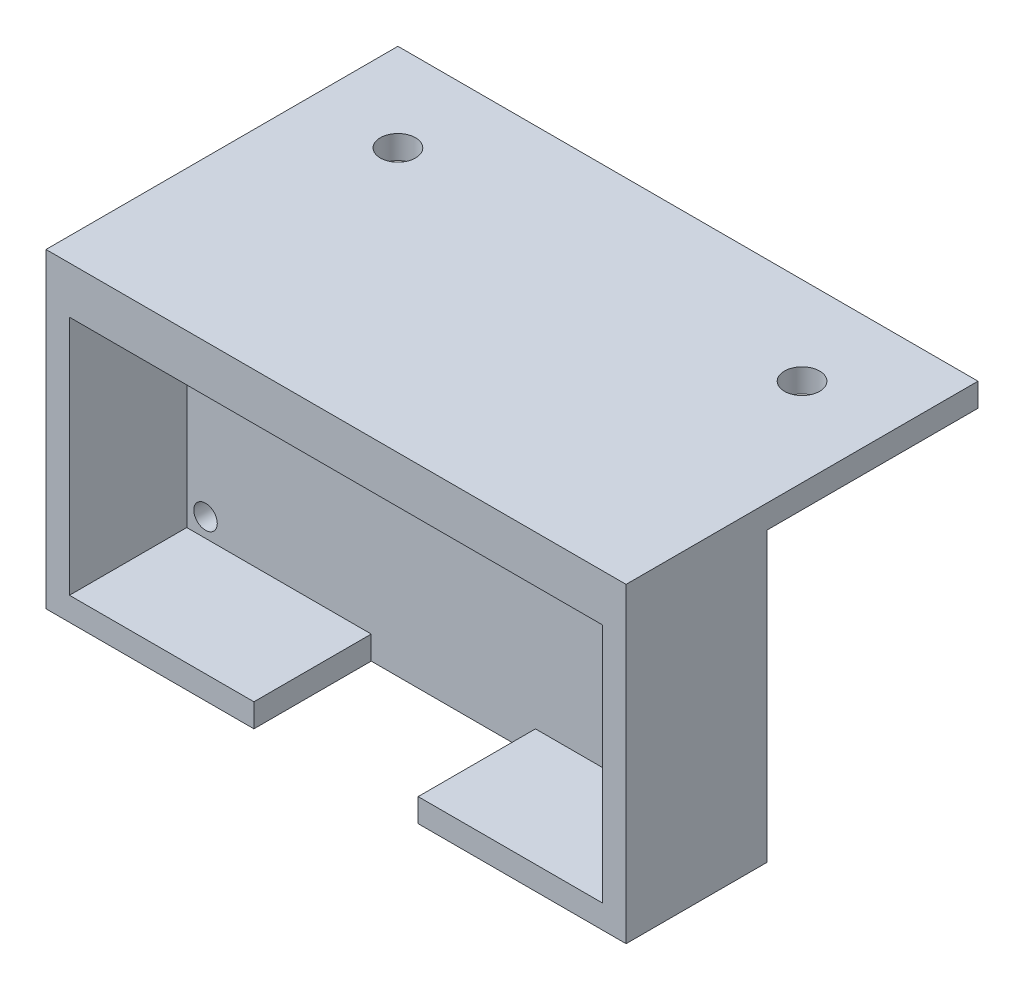
ISO-10303-21;
HEADER;
FILE_DESCRIPTION(('STEP AP214'),'2;1');
FILE_NAME('part.step','',(''),(''),'','','');
FILE_SCHEMA(('AUTOMOTIVE_DESIGN { 1 0 10303 214 1 1 1 1 }'));
ENDSEC;
DATA;
#1=APPLICATION_CONTEXT('core data for automotive mechanical design processes');
#2=APPLICATION_PROTOCOL_DEFINITION('international standard','automotive_design',2000,#1);
#3=PRODUCT_CONTEXT('',#1,'mechanical');
#4=PRODUCT('Part','Part','',(#3));
#5=PRODUCT_RELATED_PRODUCT_CATEGORY('part','',(#4));
#6=PRODUCT_DEFINITION_FORMATION('','',#4);
#7=PRODUCT_DEFINITION_CONTEXT('part definition',#1,'design');
#8=PRODUCT_DEFINITION('design','',#6,#7);
#9=PRODUCT_DEFINITION_SHAPE('','',#8);
#10=(LENGTH_UNIT() NAMED_UNIT(*) SI_UNIT(.MILLI.,.METRE.));
#11=(NAMED_UNIT(*) PLANE_ANGLE_UNIT() SI_UNIT($,.RADIAN.));
#12=(NAMED_UNIT(*) SI_UNIT($,.STERADIAN.) SOLID_ANGLE_UNIT());
#13=UNCERTAINTY_MEASURE_WITH_UNIT(LENGTH_MEASURE(1.E-05),#10,'distance_accuracy_value','');
#14=(GEOMETRIC_REPRESENTATION_CONTEXT(3) GLOBAL_UNCERTAINTY_ASSIGNED_CONTEXT((#13)) GLOBAL_UNIT_ASSIGNED_CONTEXT((#10,
#11,#12)) REPRESENTATION_CONTEXT('',''));
#15=CARTESIAN_POINT('',(0.,0.,0.));
#16=DIRECTION('',(0.,0.,1.));
#17=DIRECTION('',(1.,0.,0.));
#18=AXIS2_PLACEMENT_3D('',#15,#16,#17);
#19=CARTESIAN_POINT('',(-22.9841809315405,9.52821041214751,10.));
#20=DIRECTION('',(1.,0.,0.));
#21=DIRECTION('',(0.,1.,0.));
#22=AXIS2_PLACEMENT_3D('',#19,#20,#21);
#23=PLANE('',#22);
#24=DIRECTION('',(0.,-1.,0.));
#25=VECTOR('',#24,1.);
#26=CARTESIAN_POINT('',(-22.9841809315405,9.52821041214751,10.));
#27=LINE('',#26,#25);
#28=CARTESIAN_POINT('',(-22.9841809315405,11.5282104121475,10.));
#29=VERTEX_POINT('',#28);
#30=CARTESIAN_POINT('',(-22.9841809315405,-15.0017895878525,10.));
#31=VERTEX_POINT('',#30);
#32=EDGE_CURVE('E128',#29,#31,#27,.T.);
#33=ORIENTED_EDGE('',*,*,#32,.F.);
#34=DIRECTION('',(0.,0.,1.));
#35=VECTOR('',#34,1.);
#36=CARTESIAN_POINT('',(-22.9841809315405,11.5282104121475,10.));
#37=LINE('',#36,#35);
#38=CARTESIAN_POINT('',(-22.9841809315405,11.5282104121475,-20.));
#39=VERTEX_POINT('',#38);
#40=EDGE_CURVE('E132',#39,#29,#37,.T.);
#41=ORIENTED_EDGE('',*,*,#40,.F.);
#42=DIRECTION('',(0.,-1.,0.));
#43=VECTOR('',#42,1.);
#44=CARTESIAN_POINT('',(-22.9841809315405,11.5282104121475,-20.));
#45=LINE('',#44,#43);
#46=CARTESIAN_POINT('',(-22.9841809315405,9.52821041214751,-20.));
#47=VERTEX_POINT('',#46);
#48=EDGE_CURVE('E160',#39,#47,#45,.T.);
#49=ORIENTED_EDGE('',*,*,#48,.T.);
#50=DIRECTION('',(0.,0.,1.));
#51=VECTOR('',#50,1.);
#52=CARTESIAN_POINT('',(-22.9841809315405,9.52821041214751,10.));
#53=LINE('',#52,#51);
#54=CARTESIAN_POINT('',(-22.9841809315405,9.52821041214751,-2.));
#55=VERTEX_POINT('',#54);
#56=EDGE_CURVE('E161',#47,#55,#53,.T.);
#57=ORIENTED_EDGE('',*,*,#56,.T.);
#58=DIRECTION('',(0.,1.,0.));
#59=VECTOR('',#58,1.);
#60=CARTESIAN_POINT('',(-22.9841809315405,9.52821041214751,-2.));
#61=LINE('',#60,#59);
#62=CARTESIAN_POINT('',(-22.9841809315405,-15.0017895878525,-2.));
#63=VERTEX_POINT('',#62);
#64=EDGE_CURVE('E195',#63,#55,#61,.T.);
#65=ORIENTED_EDGE('',*,*,#64,.F.);
#66=DIRECTION('',(0.,0.,-1.));
#67=VECTOR('',#66,1.);
#68=CARTESIAN_POINT('',(-22.9841809315405,-15.0017895878525,10.));
#69=LINE('',#68,#67);
#70=EDGE_CURVE('E11',#31,#63,#69,.T.);
#71=ORIENTED_EDGE('',*,*,#70,.F.);
#72=EDGE_LOOP('',(#33,#41,#49,#57,#65,#71));
#73=FACE_BOUND('',#72,.T.);
#74=ADVANCED_FACE('F33',(#73),#23,.F.);
#75=CARTESIAN_POINT('',(-5.25918093154049,-13.0017895878525,10.));
#76=DIRECTION('',(-1.,0.,0.));
#77=DIRECTION('',(0.,-1.,0.));
#78=AXIS2_PLACEMENT_3D('',#75,#76,#77);
#79=PLANE('',#78);
#80=DIRECTION('',(0.,1.,0.));
#81=VECTOR('',#80,1.);
#82=CARTESIAN_POINT('',(-5.25918093154049,-13.0017895878525,0.));
#83=LINE('',#82,#81);
#84=CARTESIAN_POINT('',(-5.25918093154049,-15.0017895878525,0.));
#85=VERTEX_POINT('',#84);
#86=CARTESIAN_POINT('',(-5.25918093154049,-13.0017895878525,0.));
#87=VERTEX_POINT('',#86);
#88=EDGE_CURVE('E207',#85,#87,#83,.T.);
#89=ORIENTED_EDGE('',*,*,#88,.T.);
#90=DIRECTION('',(0.,0.,-1.));
#91=VECTOR('',#90,1.);
#92=CARTESIAN_POINT('',(-5.25918093154049,-13.0017895878525,10.));
#93=LINE('',#92,#91);
#94=CARTESIAN_POINT('',(-5.25918093154049,-13.0017895878525,10.));
#95=VERTEX_POINT('',#94);
#96=EDGE_CURVE('E266',#95,#87,#93,.T.);
#97=ORIENTED_EDGE('',*,*,#96,.F.);
#98=DIRECTION('',(0.,1.,0.));
#99=VECTOR('',#98,1.);
#100=CARTESIAN_POINT('',(-5.25918093154049,-13.0017895878525,10.));
#101=LINE('',#100,#99);
#102=CARTESIAN_POINT('',(-5.25918093154049,-15.0017895878525,10.));
#103=VERTEX_POINT('',#102);
#104=EDGE_CURVE('E211',#103,#95,#101,.T.);
#105=ORIENTED_EDGE('',*,*,#104,.F.);
#106=DIRECTION('',(0.,0.,-1.));
#107=VECTOR('',#106,1.);
#108=CARTESIAN_POINT('',(-5.25918093154049,-15.0017895878525,10.));
#109=LINE('',#108,#107);
#110=EDGE_CURVE('E41',#103,#85,#109,.T.);
#111=ORIENTED_EDGE('',*,*,#110,.T.);
#112=EDGE_LOOP('',(#89,#97,#105,#111));
#113=FACE_BOUND('',#112,.T.);
#114=ADVANCED_FACE('F272',(#113),#79,.F.);
#115=CARTESIAN_POINT('',(-20.9841809315405,-13.0017895878525,10.));
#116=DIRECTION('',(0.,-1.,0.));
#117=DIRECTION('',(1.,0.,0.));
#118=AXIS2_PLACEMENT_3D('',#115,#116,#117);
#119=PLANE('',#118);
#120=DIRECTION('',(-1.,0.,0.));
#121=VECTOR('',#120,1.);
#122=CARTESIAN_POINT('',(-20.9841809315405,-13.0017895878525,0.));
#123=LINE('',#122,#121);
#124=CARTESIAN_POINT('',(-20.9841809315405,-13.0017895878525,0.));
#125=VERTEX_POINT('',#124);
#126=EDGE_CURVE('E230',#87,#125,#123,.T.);
#127=ORIENTED_EDGE('',*,*,#126,.T.);
#128=DIRECTION('',(0.,0.,-1.));
#129=VECTOR('',#128,1.);
#130=CARTESIAN_POINT('',(-20.9841809315405,-13.0017895878525,10.));
#131=LINE('',#130,#129);
#132=CARTESIAN_POINT('',(-20.9841809315405,-13.0017895878525,10.));
#133=VERTEX_POINT('',#132);
#134=EDGE_CURVE('E263',#133,#125,#131,.T.);
#135=ORIENTED_EDGE('',*,*,#134,.F.);
#136=DIRECTION('',(-1.,0.,0.));
#137=VECTOR('',#136,1.);
#138=CARTESIAN_POINT('',(-20.9841809315405,-13.0017895878525,10.));
#139=LINE('',#138,#137);
#140=EDGE_CURVE('E213',#95,#133,#139,.T.);
#141=ORIENTED_EDGE('',*,*,#140,.F.);
#142=ORIENTED_EDGE('',*,*,#96,.T.);
#143=EDGE_LOOP('',(#127,#135,#141,#142));
#144=FACE_BOUND('',#143,.T.);
#145=ADVANCED_FACE('F302',(#144),#119,.F.);
#146=CARTESIAN_POINT('',(-20.9841809315405,7.52821041214751,10.));
#147=DIRECTION('',(-1.,0.,0.));
#148=DIRECTION('',(0.,-1.,0.));
#149=AXIS2_PLACEMENT_3D('',#146,#147,#148);
#150=PLANE('',#149);
#151=DIRECTION('',(0.,1.,0.));
#152=VECTOR('',#151,1.);
#153=CARTESIAN_POINT('',(-20.9841809315405,7.52821041214751,0.));
#154=LINE('',#153,#152);
#155=CARTESIAN_POINT('',(-20.9841809315405,7.52821041214751,0.));
#156=VERTEX_POINT('',#155);
#157=EDGE_CURVE('E233',#125,#156,#154,.T.);
#158=ORIENTED_EDGE('',*,*,#157,.T.);
#159=DIRECTION('',(0.,0.,-1.));
#160=VECTOR('',#159,1.);
#161=CARTESIAN_POINT('',(-20.9841809315405,7.52821041214751,10.));
#162=LINE('',#161,#160);
#163=CARTESIAN_POINT('',(-20.9841809315405,7.52821041214751,10.));
#164=VERTEX_POINT('',#163);
#165=EDGE_CURVE('E260',#164,#156,#162,.T.);
#166=ORIENTED_EDGE('',*,*,#165,.F.);
#167=DIRECTION('',(0.,1.,0.));
#168=VECTOR('',#167,1.);
#169=CARTESIAN_POINT('',(-20.9841809315405,7.52821041214751,10.));
#170=LINE('',#169,#168);
#171=EDGE_CURVE('E215',#133,#164,#170,.T.);
#172=ORIENTED_EDGE('',*,*,#171,.F.);
#173=ORIENTED_EDGE('',*,*,#134,.T.);
#174=EDGE_LOOP('',(#158,#166,#172,#173));
#175=FACE_BOUND('',#174,.T.);
#176=ADVANCED_FACE('F297',(#175),#150,.F.);
#177=CARTESIAN_POINT('',(-20.9841809315405,7.52821041214751,10.));
#178=DIRECTION('',(0.,1.,0.));
#179=DIRECTION('',(-1.,0.,0.));
#180=AXIS2_PLACEMENT_3D('',#177,#178,#179);
#181=PLANE('',#180);
#182=DIRECTION('',(1.,0.,0.));
#183=VECTOR('',#182,1.);
#184=CARTESIAN_POINT('',(-20.9841809315405,7.52821041214751,0.));
#185=LINE('',#184,#183);
#186=CARTESIAN_POINT('',(24.4658190684595,7.52821041214751,0.));
#187=VERTEX_POINT('',#186);
#188=EDGE_CURVE('E236',#156,#187,#185,.T.);
#189=ORIENTED_EDGE('',*,*,#188,.T.);
#190=DIRECTION('',(0.,0.,-1.));
#191=VECTOR('',#190,1.);
#192=CARTESIAN_POINT('',(24.4658190684595,7.52821041214751,10.));
#193=LINE('',#192,#191);
#194=CARTESIAN_POINT('',(24.4658190684595,7.52821041214751,10.));
#195=VERTEX_POINT('',#194);
#196=EDGE_CURVE('E257',#195,#187,#193,.T.);
#197=ORIENTED_EDGE('',*,*,#196,.F.);
#198=DIRECTION('',(1.,0.,0.));
#199=VECTOR('',#198,1.);
#200=CARTESIAN_POINT('',(-20.9841809315405,7.52821041214751,10.));
#201=LINE('',#200,#199);
#202=EDGE_CURVE('E217',#164,#195,#201,.T.);
#203=ORIENTED_EDGE('',*,*,#202,.F.);
#204=ORIENTED_EDGE('',*,*,#165,.T.);
#205=EDGE_LOOP('',(#189,#197,#203,#204));
#206=FACE_BOUND('',#205,.T.);
#207=ADVANCED_FACE('F294',(#206),#181,.F.);
#208=CARTESIAN_POINT('',(24.4658190684595,7.52821041214751,10.));
#209=DIRECTION('',(1.,0.,0.));
#210=DIRECTION('',(0.,1.,0.));
#211=AXIS2_PLACEMENT_3D('',#208,#209,#210);
#212=PLANE('',#211);
#213=DIRECTION('',(0.,-1.,0.));
#214=VECTOR('',#213,1.);
#215=CARTESIAN_POINT('',(24.4658190684595,7.52821041214751,0.));
#216=LINE('',#215,#214);
#217=CARTESIAN_POINT('',(24.4658190684595,-13.0017895878525,0.));
#218=VERTEX_POINT('',#217);
#219=EDGE_CURVE('E239',#187,#218,#216,.T.);
#220=ORIENTED_EDGE('',*,*,#219,.T.);
#221=DIRECTION('',(0.,0.,-1.));
#222=VECTOR('',#221,1.);
#223=CARTESIAN_POINT('',(24.4658190684595,-13.0017895878525,10.));
#224=LINE('',#223,#222);
#225=CARTESIAN_POINT('',(24.4658190684595,-13.0017895878525,10.));
#226=VERTEX_POINT('',#225);
#227=EDGE_CURVE('E254',#226,#218,#224,.T.);
#228=ORIENTED_EDGE('',*,*,#227,.F.);
#229=DIRECTION('',(0.,-1.,0.));
#230=VECTOR('',#229,1.);
#231=CARTESIAN_POINT('',(24.4658190684595,7.52821041214751,10.));
#232=LINE('',#231,#230);
#233=EDGE_CURVE('E219',#195,#226,#232,.T.);
#234=ORIENTED_EDGE('',*,*,#233,.F.);
#235=ORIENTED_EDGE('',*,*,#196,.T.);
#236=EDGE_LOOP('',(#220,#228,#234,#235));
#237=FACE_BOUND('',#236,.T.);
#238=ADVANCED_FACE('F289',(#237),#212,.F.);
#239=CARTESIAN_POINT('',(8.74081906845951,-13.0017895878525,10.));
#240=DIRECTION('',(0.,-1.,0.));
#241=DIRECTION('',(0.,0.,-1.));
#242=AXIS2_PLACEMENT_3D('',#239,#240,#241);
#243=PLANE('',#242);
#244=DIRECTION('',(-1.,0.,0.));
#245=VECTOR('',#244,1.);
#246=CARTESIAN_POINT('',(8.74081906845951,-13.0017895878525,0.));
#247=LINE('',#246,#245);
#248=CARTESIAN_POINT('',(8.74081906845951,-13.0017895878525,0.));
#249=VERTEX_POINT('',#248);
#250=EDGE_CURVE('E242',#218,#249,#247,.T.);
#251=ORIENTED_EDGE('',*,*,#250,.T.);
#252=DIRECTION('',(0.,0.,-1.));
#253=VECTOR('',#252,1.);
#254=CARTESIAN_POINT('',(8.74081906845951,-13.0017895878525,10.));
#255=LINE('',#254,#253);
#256=CARTESIAN_POINT('',(8.74081906845951,-13.0017895878525,10.));
#257=VERTEX_POINT('',#256);
#258=EDGE_CURVE('E251',#257,#249,#255,.T.);
#259=ORIENTED_EDGE('',*,*,#258,.F.);
#260=DIRECTION('',(-1.,0.,0.));
#261=VECTOR('',#260,1.);
#262=CARTESIAN_POINT('',(8.74081906845951,-13.0017895878525,10.));
#263=LINE('',#262,#261);
#264=EDGE_CURVE('E221',#226,#257,#263,.T.);
#265=ORIENTED_EDGE('',*,*,#264,.F.);
#266=ORIENTED_EDGE('',*,*,#227,.T.);
#267=EDGE_LOOP('',(#251,#259,#265,#266));
#268=FACE_BOUND('',#267,.T.);
#269=ADVANCED_FACE('F286',(#268),#243,.F.);
#270=CARTESIAN_POINT('',(8.74081906845951,-13.0017895878525,10.));
#271=DIRECTION('',(1.,0.,0.));
#272=DIRECTION('',(0.,1.,0.));
#273=AXIS2_PLACEMENT_3D('',#270,#271,#272);
#274=PLANE('',#273);
#275=DIRECTION('',(0.,-1.,0.));
#276=VECTOR('',#275,1.);
#277=CARTESIAN_POINT('',(8.74081906845951,-13.0017895878525,0.));
#278=LINE('',#277,#276);
#279=CARTESIAN_POINT('',(8.74081906845951,-15.0017895878525,0.));
#280=VERTEX_POINT('',#279);
#281=EDGE_CURVE('E135',#249,#280,#278,.T.);
#282=ORIENTED_EDGE('',*,*,#281,.T.);
#283=DIRECTION('',(0.,0.,-1.));
#284=VECTOR('',#283,1.);
#285=CARTESIAN_POINT('',(8.74081906845951,-15.0017895878525,10.));
#286=LINE('',#285,#284);
#287=CARTESIAN_POINT('',(8.74081906845951,-15.0017895878525,10.));
#288=VERTEX_POINT('',#287);
#289=EDGE_CURVE('E248',#288,#280,#286,.T.);
#290=ORIENTED_EDGE('',*,*,#289,.F.);
#291=DIRECTION('',(0.,-1.,0.));
#292=VECTOR('',#291,1.);
#293=CARTESIAN_POINT('',(8.74081906845951,-13.0017895878525,10.));
#294=LINE('',#293,#292);
#295=EDGE_CURVE('E223',#257,#288,#294,.T.);
#296=ORIENTED_EDGE('',*,*,#295,.F.);
#297=ORIENTED_EDGE('',*,*,#258,.T.);
#298=EDGE_LOOP('',(#282,#290,#296,#297));
#299=FACE_BOUND('',#298,.T.);
#300=ADVANCED_FACE('F281',(#299),#274,.F.);
#301=CARTESIAN_POINT('',(8.74081906845951,-15.0017895878525,10.));
#302=DIRECTION('',(0.,1.,0.));
#303=DIRECTION('',(0.,0.,1.));
#304=AXIS2_PLACEMENT_3D('',#301,#302,#303);
#305=PLANE('',#304);
#306=ORIENTED_EDGE('',*,*,#289,.T.);
#307=DIRECTION('',(-1.,0.,0.));
#308=VECTOR('',#307,1.);
#309=CARTESIAN_POINT('',(-22.9841809315405,-15.0017895878525,0.));
#310=LINE('',#309,#308);
#311=EDGE_CURVE('E192',#280,#85,#310,.T.);
#312=ORIENTED_EDGE('',*,*,#311,.T.);
#313=ORIENTED_EDGE('',*,*,#110,.F.);
#314=DIRECTION('',(1.,0.,0.));
#315=VECTOR('',#314,1.);
#316=CARTESIAN_POINT('',(-22.9841809315405,-15.0017895878525,10.));
#317=LINE('',#316,#315);
#318=EDGE_CURVE('E134',#31,#103,#317,.T.);
#319=ORIENTED_EDGE('',*,*,#318,.F.);
#320=ORIENTED_EDGE('',*,*,#70,.T.);
#321=DIRECTION('',(-1.,0.,0.));
#322=VECTOR('',#321,1.);
#323=CARTESIAN_POINT('',(-22.9841809315405,-15.0017895878525,-2.));
#324=LINE('',#323,#322);
#325=CARTESIAN_POINT('',(26.4658190684595,-15.0017895878525,-2.));
#326=VERTEX_POINT('',#325);
#327=EDGE_CURVE('E204',#326,#63,#324,.T.);
#328=ORIENTED_EDGE('',*,*,#327,.F.);
#329=DIRECTION('',(0.,0.,-1.));
#330=VECTOR('',#329,1.);
#331=CARTESIAN_POINT('',(26.4658190684595,-15.0017895878525,10.));
#332=LINE('',#331,#330);
#333=CARTESIAN_POINT('',(26.4658190684595,-15.0017895878525,10.));
#334=VERTEX_POINT('',#333);
#335=EDGE_CURVE('E227',#334,#326,#332,.T.);
#336=ORIENTED_EDGE('',*,*,#335,.F.);
#337=DIRECTION('',(1.,0.,0.));
#338=VECTOR('',#337,1.);
#339=CARTESIAN_POINT('',(8.74081906845951,-15.0017895878525,10.));
#340=LINE('',#339,#338);
#341=EDGE_CURVE('E48',#288,#334,#340,.T.);
#342=ORIENTED_EDGE('',*,*,#341,.F.);
#343=EDGE_LOOP('',(#306,#312,#313,#319,#320,#328,#336,#342));
#344=FACE_BOUND('',#343,.T.);
#345=ADVANCED_FACE('F275',(#344),#305,.F.);
#346=CARTESIAN_POINT('',(26.4658190684595,9.52821041214751,10.));
#347=DIRECTION('',(-1.,0.,0.));
#348=DIRECTION('',(0.,0.,1.));
#349=AXIS2_PLACEMENT_3D('',#346,#347,#348);
#350=PLANE('',#349);
#351=ORIENTED_EDGE('',*,*,#335,.T.);
#352=DIRECTION('',(0.,-1.,0.));
#353=VECTOR('',#352,1.);
#354=CARTESIAN_POINT('',(26.4658190684595,9.52821041214751,-2.));
#355=LINE('',#354,#353);
#356=CARTESIAN_POINT('',(26.4658190684595,9.52821041214751,-2.));
#357=VERTEX_POINT('',#356);
#358=EDGE_CURVE('E201',#357,#326,#355,.T.);
#359=ORIENTED_EDGE('',*,*,#358,.F.);
#360=DIRECTION('',(0.,0.,-1.));
#361=VECTOR('',#360,1.);
#362=CARTESIAN_POINT('',(26.4658190684595,9.52821041214751,10.));
#363=LINE('',#362,#361);
#364=CARTESIAN_POINT('',(26.4658190684595,9.52821041214751,-20.));
#365=VERTEX_POINT('',#364);
#366=EDGE_CURVE('E152',#357,#365,#363,.T.);
#367=ORIENTED_EDGE('',*,*,#366,.T.);
#368=DIRECTION('',(0.,-1.,0.));
#369=VECTOR('',#368,1.);
#370=CARTESIAN_POINT('',(26.4658190684595,11.5282104121475,-20.));
#371=LINE('',#370,#369);
#372=CARTESIAN_POINT('',(26.4658190684595,11.5282104121475,-20.));
#373=VERTEX_POINT('',#372);
#374=EDGE_CURVE('E167',#373,#365,#371,.T.);
#375=ORIENTED_EDGE('',*,*,#374,.F.);
#376=DIRECTION('',(0.,0.,-1.));
#377=VECTOR('',#376,1.);
#378=CARTESIAN_POINT('',(26.4658190684595,11.5282104121475,10.));
#379=LINE('',#378,#377);
#380=CARTESIAN_POINT('',(26.4658190684595,11.5282104121475,10.));
#381=VERTEX_POINT('',#380);
#382=EDGE_CURVE('E144',#381,#373,#379,.T.);
#383=ORIENTED_EDGE('',*,*,#382,.F.);
#384=DIRECTION('',(0.,1.,0.));
#385=VECTOR('',#384,1.);
#386=CARTESIAN_POINT('',(26.4658190684595,9.52821041214751,10.));
#387=LINE('',#386,#385);
#388=EDGE_CURVE('E141',#334,#381,#387,.T.);
#389=ORIENTED_EDGE('',*,*,#388,.F.);
#390=EDGE_LOOP('',(#351,#359,#367,#375,#383,#389));
#391=FACE_BOUND('',#390,.T.);
#392=ADVANCED_FACE('F372',(#391),#350,.F.);
#393=CARTESIAN_POINT('',(0.,0.,10.));
#394=DIRECTION('',(0.,0.,1.));
#395=DIRECTION('',(1.,0.,0.));
#396=AXIS2_PLACEMENT_3D('',#393,#394,#395);
#397=PLANE('',#396);
#398=ORIENTED_EDGE('',*,*,#32,.T.);
#399=ORIENTED_EDGE('',*,*,#318,.T.);
#400=ORIENTED_EDGE('',*,*,#104,.T.);
#401=ORIENTED_EDGE('',*,*,#140,.T.);
#402=ORIENTED_EDGE('',*,*,#171,.T.);
#403=ORIENTED_EDGE('',*,*,#202,.T.);
#404=ORIENTED_EDGE('',*,*,#233,.T.);
#405=ORIENTED_EDGE('',*,*,#264,.T.);
#406=ORIENTED_EDGE('',*,*,#295,.T.);
#407=ORIENTED_EDGE('',*,*,#341,.T.);
#408=ORIENTED_EDGE('',*,*,#388,.T.);
#409=DIRECTION('',(1.,0.,0.));
#410=VECTOR('',#409,1.);
#411=CARTESIAN_POINT('',(-22.9841809315405,11.5282104121475,10.));
#412=LINE('',#411,#410);
#413=EDGE_CURVE('E138',#29,#381,#412,.T.);
#414=ORIENTED_EDGE('',*,*,#413,.F.);
#415=EDGE_LOOP('',(#398,#399,#400,#401,#402,#403,#404,#405,#406,#407,#408,#414));
#416=FACE_BOUND('',#415,.T.);
#417=ADVANCED_FACE('F139',(#416),#397,.T.);
#418=CARTESIAN_POINT('',(0.,0.,0.));
#419=DIRECTION('',(0.,0.,1.));
#420=DIRECTION('',(1.,0.,0.));
#421=AXIS2_PLACEMENT_3D('',#418,#419,#420);
#422=PLANE('',#421);
#423=CARTESIAN_POINT('',(22.8658190684595,-11.4017895878525,0.));
#424=DIRECTION('',(0.,0.,1.));
#425=DIRECTION('',(-1.,0.,0.));
#426=AXIS2_PLACEMENT_3D('',#423,#424,#425);
#427=CIRCLE('',#426,1.);
#428=CARTESIAN_POINT('',(21.8658190684595,-11.4017895878525,0.));
#429=VERTEX_POINT('',#428);
#430=EDGE_CURVE('E175',#429,#429,#427,.T.);
#431=ORIENTED_EDGE('',*,*,#430,.F.);
#432=EDGE_LOOP('',(#431));
#433=FACE_BOUND('',#432,.T.);
#434=CARTESIAN_POINT('',(22.8658190684595,5.92821041214751,0.));
#435=DIRECTION('',(0.,0.,1.));
#436=DIRECTION('',(1.,0.,0.));
#437=AXIS2_PLACEMENT_3D('',#434,#435,#436);
#438=CIRCLE('',#437,1.);
#439=CARTESIAN_POINT('',(23.8658190684595,5.92821041214751,0.));
#440=VERTEX_POINT('',#439);
#441=EDGE_CURVE('E181',#440,#440,#438,.T.);
#442=ORIENTED_EDGE('',*,*,#441,.F.);
#443=EDGE_LOOP('',(#442));
#444=FACE_BOUND('',#443,.T.);
#445=CARTESIAN_POINT('',(-19.3841809315405,5.92821041214751,0.));
#446=DIRECTION('',(0.,0.,1.));
#447=DIRECTION('',(-1.,0.,0.));
#448=AXIS2_PLACEMENT_3D('',#445,#446,#447);
#449=CIRCLE('',#448,1.);
#450=CARTESIAN_POINT('',(-20.3841809315405,5.92821041214751,0.));
#451=VERTEX_POINT('',#450);
#452=EDGE_CURVE('E170',#451,#451,#449,.T.);
#453=ORIENTED_EDGE('',*,*,#452,.F.);
#454=EDGE_LOOP('',(#453));
#455=FACE_BOUND('',#454,.T.);
#456=CARTESIAN_POINT('',(-19.3841809315405,-11.4017895878525,0.));
#457=DIRECTION('',(0.,0.,1.));
#458=DIRECTION('',(1.,0.,0.));
#459=AXIS2_PLACEMENT_3D('',#456,#457,#458);
#460=CIRCLE('',#459,1.);
#461=CARTESIAN_POINT('',(-18.3841809315405,-11.4017895878525,0.));
#462=VERTEX_POINT('',#461);
#463=EDGE_CURVE('E174',#462,#462,#460,.T.);
#464=ORIENTED_EDGE('',*,*,#463,.F.);
#465=EDGE_LOOP('',(#464));
#466=FACE_BOUND('',#465,.T.);
#467=ORIENTED_EDGE('',*,*,#281,.F.);
#468=ORIENTED_EDGE('',*,*,#250,.F.);
#469=ORIENTED_EDGE('',*,*,#219,.F.);
#470=ORIENTED_EDGE('',*,*,#188,.F.);
#471=ORIENTED_EDGE('',*,*,#157,.F.);
#472=ORIENTED_EDGE('',*,*,#126,.F.);
#473=ORIENTED_EDGE('',*,*,#88,.F.);
#474=ORIENTED_EDGE('',*,*,#311,.F.);
#475=EDGE_LOOP('',(#467,#468,#469,#470,#471,#472,#473,#474));
#476=FACE_BOUND('',#475,.T.);
#477=ADVANCED_FACE('F278',(#433,#444,#455,#466,#476),#422,.T.);
#478=CARTESIAN_POINT('',(0.,0.,-2.));
#479=DIRECTION('',(0.,0.,1.));
#480=DIRECTION('',(1.,0.,0.));
#481=AXIS2_PLACEMENT_3D('',#478,#479,#480);
#482=PLANE('',#481);
#483=CARTESIAN_POINT('',(22.8658190684595,-11.4017895878525,-2.));
#484=DIRECTION('',(0.,0.,1.));
#485=DIRECTION('',(-1.,0.,0.));
#486=AXIS2_PLACEMENT_3D('',#483,#484,#485);
#487=CIRCLE('',#486,1.);
#488=CARTESIAN_POINT('',(21.8658190684595,-11.4017895878525,-2.));
#489=VERTEX_POINT('',#488);
#490=EDGE_CURVE('E171',#489,#489,#487,.T.);
#491=ORIENTED_EDGE('',*,*,#490,.T.);
#492=EDGE_LOOP('',(#491));
#493=FACE_BOUND('',#492,.T.);
#494=CARTESIAN_POINT('',(22.8658190684595,5.92821041214751,-2.));
#495=DIRECTION('',(0.,0.,1.));
#496=DIRECTION('',(1.,0.,0.));
#497=AXIS2_PLACEMENT_3D('',#494,#495,#496);
#498=CIRCLE('',#497,1.);
#499=CARTESIAN_POINT('',(23.8658190684595,5.92821041214751,-2.));
#500=VERTEX_POINT('',#499);
#501=EDGE_CURVE('E178',#500,#500,#498,.T.);
#502=ORIENTED_EDGE('',*,*,#501,.T.);
#503=EDGE_LOOP('',(#502));
#504=FACE_BOUND('',#503,.T.);
#505=CARTESIAN_POINT('',(-19.3841809315405,5.92821041214751,-2.));
#506=DIRECTION('',(0.,0.,1.));
#507=DIRECTION('',(-1.,0.,0.));
#508=AXIS2_PLACEMENT_3D('',#505,#506,#507);
#509=CIRCLE('',#508,1.);
#510=CARTESIAN_POINT('',(-20.3841809315405,5.92821041214751,-2.));
#511=VERTEX_POINT('',#510);
#512=EDGE_CURVE('E184',#511,#511,#509,.T.);
#513=ORIENTED_EDGE('',*,*,#512,.T.);
#514=EDGE_LOOP('',(#513));
#515=FACE_BOUND('',#514,.T.);
#516=CARTESIAN_POINT('',(-19.3841809315405,-11.4017895878525,-2.));
#517=DIRECTION('',(0.,0.,1.));
#518=DIRECTION('',(1.,0.,0.));
#519=AXIS2_PLACEMENT_3D('',#516,#517,#518);
#520=CIRCLE('',#519,1.);
#521=CARTESIAN_POINT('',(-18.3841809315405,-11.4017895878525,-2.));
#522=VERTEX_POINT('',#521);
#523=EDGE_CURVE('E189',#522,#522,#520,.T.);
#524=ORIENTED_EDGE('',*,*,#523,.T.);
#525=EDGE_LOOP('',(#524));
#526=FACE_BOUND('',#525,.T.);
#527=ORIENTED_EDGE('',*,*,#64,.T.);
#528=DIRECTION('',(1.,0.,0.));
#529=VECTOR('',#528,1.);
#530=CARTESIAN_POINT('',(-22.9841809315405,9.52821041214751,-2.));
#531=LINE('',#530,#529);
#532=EDGE_CURVE('E198',#55,#357,#531,.T.);
#533=ORIENTED_EDGE('',*,*,#532,.T.);
#534=ORIENTED_EDGE('',*,*,#358,.T.);
#535=ORIENTED_EDGE('',*,*,#327,.T.);
#536=EDGE_LOOP('',(#527,#533,#534,#535));
#537=FACE_BOUND('',#536,.T.);
#538=ADVANCED_FACE('F385',(#493,#504,#515,#526,#537),#482,.F.);
#539=CARTESIAN_POINT('',(-19.3841809315405,-11.4017895878525,-2.));
#540=DIRECTION('',(0.,0.,1.));
#541=DIRECTION('',(1.,0.,0.));
#542=AXIS2_PLACEMENT_3D('',#539,#540,#541);
#543=CYLINDRICAL_SURFACE('',#542,1.);
#544=ORIENTED_EDGE('',*,*,#523,.F.);
#545=EDGE_LOOP('',(#544));
#546=FACE_BOUND('',#545,.T.);
#547=ORIENTED_EDGE('',*,*,#463,.T.);
#548=EDGE_LOOP('',(#547));
#549=FACE_BOUND('',#548,.T.);
#550=ADVANCED_FACE('F394',(#546,#549),#543,.F.);
#551=CARTESIAN_POINT('',(-19.3841809315405,5.92821041214751,-2.));
#552=DIRECTION('',(0.,0.,1.));
#553=DIRECTION('',(1.,0.,0.));
#554=AXIS2_PLACEMENT_3D('',#551,#552,#553);
#555=CYLINDRICAL_SURFACE('',#554,1.);
#556=ORIENTED_EDGE('',*,*,#512,.F.);
#557=EDGE_LOOP('',(#556));
#558=FACE_BOUND('',#557,.T.);
#559=ORIENTED_EDGE('',*,*,#452,.T.);
#560=EDGE_LOOP('',(#559));
#561=FACE_BOUND('',#560,.T.);
#562=ADVANCED_FACE('F399',(#558,#561),#555,.F.);
#563=CARTESIAN_POINT('',(22.8658190684595,5.92821041214751,-2.));
#564=DIRECTION('',(0.,0.,1.));
#565=DIRECTION('',(1.,0.,0.));
#566=AXIS2_PLACEMENT_3D('',#563,#564,#565);
#567=CYLINDRICAL_SURFACE('',#566,1.);
#568=ORIENTED_EDGE('',*,*,#501,.F.);
#569=EDGE_LOOP('',(#568));
#570=FACE_BOUND('',#569,.T.);
#571=ORIENTED_EDGE('',*,*,#441,.T.);
#572=EDGE_LOOP('',(#571));
#573=FACE_BOUND('',#572,.T.);
#574=ADVANCED_FACE('F409',(#570,#573),#567,.F.);
#575=CARTESIAN_POINT('',(22.8658190684595,-11.4017895878525,-2.));
#576=DIRECTION('',(0.,0.,1.));
#577=DIRECTION('',(1.,0.,0.));
#578=AXIS2_PLACEMENT_3D('',#575,#576,#577);
#579=CYLINDRICAL_SURFACE('',#578,1.);
#580=ORIENTED_EDGE('',*,*,#490,.F.);
#581=EDGE_LOOP('',(#580));
#582=FACE_BOUND('',#581,.T.);
#583=ORIENTED_EDGE('',*,*,#430,.T.);
#584=EDGE_LOOP('',(#583));
#585=FACE_BOUND('',#584,.T.);
#586=ADVANCED_FACE('F418',(#582,#585),#579,.F.);
#587=CARTESIAN_POINT('',(0.,9.52821041214751,0.));
#588=DIRECTION('',(0.,-1.,0.));
#589=DIRECTION('',(1.,0.,0.));
#590=AXIS2_PLACEMENT_3D('',#587,#588,#589);
#591=PLANE('',#590);
#592=CARTESIAN_POINT('',(18.9658190684595,9.52821041214751,-12.5));
#593=DIRECTION('',(0.,1.,0.));
#594=DIRECTION('',(1.,0.,0.));
#595=AXIS2_PLACEMENT_3D('',#592,#593,#594);
#596=CIRCLE('',#595,1.5);
#597=CARTESIAN_POINT('',(20.4658190684595,9.52821041214751,-12.5));
#598=VERTEX_POINT('',#597);
#599=EDGE_CURVE('E548',#598,#598,#596,.T.);
#600=ORIENTED_EDGE('',*,*,#599,.T.);
#601=EDGE_LOOP('',(#600));
#602=FACE_BOUND('',#601,.T.);
#603=CARTESIAN_POINT('',(-15.4841809315405,9.52821041214751,-12.5));
#604=DIRECTION('',(0.,1.,0.));
#605=DIRECTION('',(-1.,0.,0.));
#606=AXIS2_PLACEMENT_3D('',#603,#604,#605);
#607=CIRCLE('',#606,1.5);
#608=CARTESIAN_POINT('',(-16.9841809315405,9.52821041214751,-12.5));
#609=VERTEX_POINT('',#608);
#610=EDGE_CURVE('E164',#609,#609,#607,.T.);
#611=ORIENTED_EDGE('',*,*,#610,.T.);
#612=EDGE_LOOP('',(#611));
#613=FACE_BOUND('',#612,.T.);
#614=ORIENTED_EDGE('',*,*,#532,.F.);
#615=ORIENTED_EDGE('',*,*,#56,.F.);
#616=DIRECTION('',(-1.,0.,0.));
#617=VECTOR('',#616,1.);
#618=CARTESIAN_POINT('',(-22.9841809315405,9.52821041214751,-20.));
#619=LINE('',#618,#617);
#620=EDGE_CURVE('E150',#365,#47,#619,.T.);
#621=ORIENTED_EDGE('',*,*,#620,.F.);
#622=ORIENTED_EDGE('',*,*,#366,.F.);
#623=EDGE_LOOP('',(#614,#615,#621,#622));
#624=FACE_BOUND('',#623,.T.);
#625=ADVANCED_FACE('F427',(#602,#613,#624),#591,.T.);
#626=CARTESIAN_POINT('',(-22.9841809315405,11.5282104121475,-20.));
#627=DIRECTION('',(0.,0.,1.));
#628=DIRECTION('',(1.,0.,0.));
#629=AXIS2_PLACEMENT_3D('',#626,#627,#628);
#630=PLANE('',#629);
#631=ORIENTED_EDGE('',*,*,#620,.T.);
#632=ORIENTED_EDGE('',*,*,#48,.F.);
#633=DIRECTION('',(-1.,0.,0.));
#634=VECTOR('',#633,1.);
#635=CARTESIAN_POINT('',(-22.9841809315405,11.5282104121475,-20.));
#636=LINE('',#635,#634);
#637=EDGE_CURVE('E148',#373,#39,#636,.T.);
#638=ORIENTED_EDGE('',*,*,#637,.F.);
#639=ORIENTED_EDGE('',*,*,#374,.T.);
#640=EDGE_LOOP('',(#631,#632,#638,#639));
#641=FACE_BOUND('',#640,.T.);
#642=ADVANCED_FACE('F437',(#641),#630,.F.);
#643=CARTESIAN_POINT('',(0.,11.5282104121475,0.));
#644=DIRECTION('',(0.,-1.,0.));
#645=DIRECTION('',(1.,0.,0.));
#646=AXIS2_PLACEMENT_3D('',#643,#644,#645);
#647=PLANE('',#646);
#648=CARTESIAN_POINT('',(18.9658190684595,11.5282104121475,-12.5));
#649=DIRECTION('',(0.,1.,0.));
#650=DIRECTION('',(1.,0.,0.));
#651=AXIS2_PLACEMENT_3D('',#648,#649,#650);
#652=CIRCLE('',#651,1.5);
#653=CARTESIAN_POINT('',(20.4658190684595,11.5282104121475,-12.5));
#654=VERTEX_POINT('',#653);
#655=EDGE_CURVE('E551',#654,#654,#652,.T.);
#656=ORIENTED_EDGE('',*,*,#655,.F.);
#657=EDGE_LOOP('',(#656));
#658=FACE_BOUND('',#657,.T.);
#659=CARTESIAN_POINT('',(-15.4841809315405,11.5282104121475,-12.5));
#660=DIRECTION('',(0.,1.,0.));
#661=DIRECTION('',(-1.,0.,0.));
#662=AXIS2_PLACEMENT_3D('',#659,#660,#661);
#663=CIRCLE('',#662,1.5);
#664=CARTESIAN_POINT('',(-16.9841809315405,11.5282104121475,-12.5));
#665=VERTEX_POINT('',#664);
#666=EDGE_CURVE('E155',#665,#665,#663,.T.);
#667=ORIENTED_EDGE('',*,*,#666,.F.);
#668=EDGE_LOOP('',(#667));
#669=FACE_BOUND('',#668,.T.);
#670=ORIENTED_EDGE('',*,*,#40,.T.);
#671=ORIENTED_EDGE('',*,*,#413,.T.);
#672=ORIENTED_EDGE('',*,*,#382,.T.);
#673=ORIENTED_EDGE('',*,*,#637,.T.);
#674=EDGE_LOOP('',(#670,#671,#672,#673));
#675=FACE_BOUND('',#674,.T.);
#676=ADVANCED_FACE('F146',(#658,#669,#675),#647,.F.);
#677=CARTESIAN_POINT('',(-15.4841809315405,9.52821041214751,-12.5));
#678=DIRECTION('',(0.,1.,0.));
#679=DIRECTION('',(-1.,0.,0.));
#680=AXIS2_PLACEMENT_3D('',#677,#678,#679);
#681=CYLINDRICAL_SURFACE('',#680,1.5);
#682=ORIENTED_EDGE('',*,*,#610,.F.);
#683=EDGE_LOOP('',(#682));
#684=FACE_BOUND('',#683,.T.);
#685=ORIENTED_EDGE('',*,*,#666,.T.);
#686=EDGE_LOOP('',(#685));
#687=FACE_BOUND('',#686,.T.);
#688=ADVANCED_FACE('F453',(#684,#687),#681,.F.);
#689=CARTESIAN_POINT('',(18.9658190684595,9.52821041214751,-12.5));
#690=DIRECTION('',(0.,1.,0.));
#691=DIRECTION('',(-1.,0.,0.));
#692=AXIS2_PLACEMENT_3D('',#689,#690,#691);
#693=CYLINDRICAL_SURFACE('',#692,1.5);
#694=ORIENTED_EDGE('',*,*,#599,.F.);
#695=EDGE_LOOP('',(#694));
#696=FACE_BOUND('',#695,.T.);
#697=ORIENTED_EDGE('',*,*,#655,.T.);
#698=EDGE_LOOP('',(#697));
#699=FACE_BOUND('',#698,.T.);
#700=ADVANCED_FACE('F461',(#696,#699),#693,.F.);
#701=CLOSED_SHELL('',(#74,#114,#145,#176,#207,#238,#269,#300,#345,#392,#417,#477,#538,#550,#562,
#574,#586,#625,#642,#676,#688,#700));
#702=MANIFOLD_SOLID_BREP('B2',#701);
#703=ADVANCED_BREP_SHAPE_REPRESENTATION('',(#18,#702),#14);
#704=SHAPE_DEFINITION_REPRESENTATION(#9,#703);
ENDSEC;
END-ISO-10303-21;
